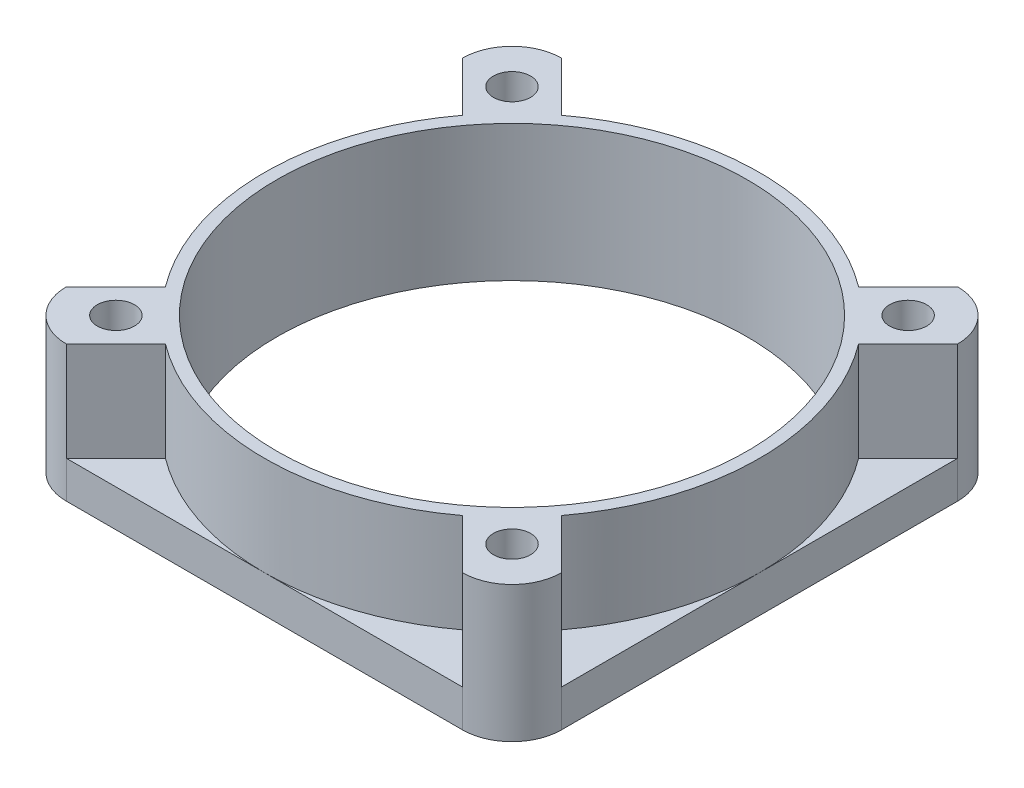
ISO-10303-21;
HEADER;
FILE_DESCRIPTION(('STEP AP214'),'2;1');
FILE_NAME('part.step','',(''),(''),'','','');
FILE_SCHEMA(('AUTOMOTIVE_DESIGN { 1 0 10303 214 1 1 1 1 }'));
ENDSEC;
DATA;
#1=APPLICATION_CONTEXT('core data for automotive mechanical design processes');
#2=APPLICATION_PROTOCOL_DEFINITION('international standard','automotive_design',2000,#1);
#3=PRODUCT_CONTEXT('',#1,'mechanical');
#4=PRODUCT('Part','Part','',(#3));
#5=PRODUCT_RELATED_PRODUCT_CATEGORY('part','',(#4));
#6=PRODUCT_DEFINITION_FORMATION('','',#4);
#7=PRODUCT_DEFINITION_CONTEXT('part definition',#1,'design');
#8=PRODUCT_DEFINITION('design','',#6,#7);
#9=PRODUCT_DEFINITION_SHAPE('','',#8);
#10=(LENGTH_UNIT() NAMED_UNIT(*) SI_UNIT(.MILLI.,.METRE.));
#11=(NAMED_UNIT(*) PLANE_ANGLE_UNIT() SI_UNIT($,.RADIAN.));
#12=(NAMED_UNIT(*) SI_UNIT($,.STERADIAN.) SOLID_ANGLE_UNIT());
#13=UNCERTAINTY_MEASURE_WITH_UNIT(LENGTH_MEASURE(1.E-05),#10,'distance_accuracy_value','');
#14=(GEOMETRIC_REPRESENTATION_CONTEXT(3) GLOBAL_UNCERTAINTY_ASSIGNED_CONTEXT((#13)) GLOBAL_UNIT_ASSIGNED_CONTEXT((#10,
#11,#12)) REPRESENTATION_CONTEXT('',''));
#15=CARTESIAN_POINT('',(0.,0.,0.));
#16=DIRECTION('',(0.,0.,1.));
#17=DIRECTION('',(1.,0.,0.));
#18=AXIS2_PLACEMENT_3D('',#15,#16,#17);
#19=CARTESIAN_POINT('',(0.,11.,0.));
#20=DIRECTION('',(0.,-1.,0.));
#21=DIRECTION('',(0.,0.,-1.));
#22=AXIS2_PLACEMENT_3D('',#19,#20,#21);
#23=PLANE('',#22);
#24=CARTESIAN_POINT('',(4.,11.,-36.));
#25=DIRECTION('',(0.,1.,0.));
#26=DIRECTION('',(0.,0.,1.));
#27=AXIS2_PLACEMENT_3D('',#24,#25,#26);
#28=CIRCLE('',#27,1.5);
#29=CARTESIAN_POINT('',(4.,11.,-34.5));
#30=VERTEX_POINT('',#29);
#31=EDGE_CURVE('E737',#30,#30,#28,.T.);
#32=ORIENTED_EDGE('',*,*,#31,.F.);
#33=EDGE_LOOP('',(#32));
#34=FACE_BOUND('',#33,.T.);
#35=CARTESIAN_POINT('',(4.,11.,-4.));
#36=DIRECTION('',(0.,1.,0.));
#37=DIRECTION('',(0.,0.,1.));
#38=AXIS2_PLACEMENT_3D('',#35,#36,#37);
#39=CIRCLE('',#38,1.5);
#40=CARTESIAN_POINT('',(4.,11.,-2.5));
#41=VERTEX_POINT('',#40);
#42=EDGE_CURVE('E743',#41,#41,#39,.T.);
#43=ORIENTED_EDGE('',*,*,#42,.F.);
#44=EDGE_LOOP('',(#43));
#45=FACE_BOUND('',#44,.T.);
#46=CARTESIAN_POINT('',(36.,11.,-4.));
#47=DIRECTION('',(0.,1.,0.));
#48=DIRECTION('',(0.,0.,1.));
#49=AXIS2_PLACEMENT_3D('',#46,#47,#48);
#50=CIRCLE('',#49,1.5);
#51=CARTESIAN_POINT('',(36.,11.,-2.5));
#52=VERTEX_POINT('',#51);
#53=EDGE_CURVE('E751',#52,#52,#50,.T.);
#54=ORIENTED_EDGE('',*,*,#53,.F.);
#55=EDGE_LOOP('',(#54));
#56=FACE_BOUND('',#55,.T.);
#57=CARTESIAN_POINT('',(36.,11.,-36.));
#58=DIRECTION('',(0.,1.,0.));
#59=DIRECTION('',(0.,0.,1.));
#60=AXIS2_PLACEMENT_3D('',#57,#58,#59);
#61=CIRCLE('',#60,1.5);
#62=CARTESIAN_POINT('',(36.,11.,-34.5));
#63=VERTEX_POINT('',#62);
#64=EDGE_CURVE('E740',#63,#63,#61,.T.);
#65=ORIENTED_EDGE('',*,*,#64,.F.);
#66=EDGE_LOOP('',(#65));
#67=FACE_BOUND('',#66,.T.);
#68=CARTESIAN_POINT('',(20.,11.,-20.));
#69=DIRECTION('',(0.,1.,0.));
#70=DIRECTION('',(0.,0.,1.));
#71=AXIS2_PLACEMENT_3D('',#68,#69,#70);
#72=CIRCLE('',#71,19.);
#73=CARTESIAN_POINT('',(20.,11.,-1.));
#74=VERTEX_POINT('',#73);
#75=EDGE_CURVE('E342',#74,#74,#72,.T.);
#76=ORIENTED_EDGE('',*,*,#75,.F.);
#77=EDGE_LOOP('',(#76));
#78=FACE_BOUND('',#77,.T.);
#79=DIRECTION('',(0.707106781186546,0.,-0.707106781186549));
#80=VECTOR('',#79,1.);
#81=CARTESIAN_POINT('',(2.00000000000001,11.,2.));
#82=LINE('',#81,#80);
#83=CARTESIAN_POINT('',(4.,11.,0.));
#84=VERTEX_POINT('',#83);
#85=CARTESIAN_POINT('',(7.99999999999999,11.,-4.00000000000001));
#86=VERTEX_POINT('',#85);
#87=EDGE_CURVE('E223',#84,#86,#82,.T.);
#88=ORIENTED_EDGE('',*,*,#87,.T.);
#89=CARTESIAN_POINT('',(20.,11.,-20.));
#90=DIRECTION('',(0.,1.,0.));
#91=DIRECTION('',(0.,0.,1.));
#92=AXIS2_PLACEMENT_3D('',#89,#90,#91);
#93=CIRCLE('',#92,20.);
#94=CARTESIAN_POINT('',(32.,11.,-4.));
#95=VERTEX_POINT('',#94);
#96=EDGE_CURVE('E394',#86,#95,#93,.T.);
#97=ORIENTED_EDGE('',*,*,#96,.T.);
#98=DIRECTION('',(-0.707106781186551,0.,-0.707106781186544));
#99=VECTOR('',#98,1.);
#100=CARTESIAN_POINT('',(17.9999999999998,11.,-18.));
#101=LINE('',#100,#99);
#102=CARTESIAN_POINT('',(36.,11.,0.));
#103=VERTEX_POINT('',#102);
#104=EDGE_CURVE('E401',#103,#95,#101,.T.);
#105=ORIENTED_EDGE('',*,*,#104,.F.);
#106=CARTESIAN_POINT('',(36.,11.,-4.));
#107=DIRECTION('',(0.,-1.,0.));
#108=DIRECTION('',(0.,0.,-1.));
#109=AXIS2_PLACEMENT_3D('',#106,#107,#108);
#110=CIRCLE('',#109,4.);
#111=CARTESIAN_POINT('',(40.,11.,-4.));
#112=VERTEX_POINT('',#111);
#113=EDGE_CURVE('E365',#103,#112,#110,.F.);
#114=ORIENTED_EDGE('',*,*,#113,.T.);
#115=DIRECTION('',(-0.707106781186551,0.,-0.707106781186544));
#116=VECTOR('',#115,1.);
#117=CARTESIAN_POINT('',(21.9999999999998,11.,-22.));
#118=LINE('',#117,#116);
#119=CARTESIAN_POINT('',(36.,11.,-7.99999999999997));
#120=VERTEX_POINT('',#119);
#121=EDGE_CURVE('E412',#112,#120,#118,.T.);
#122=ORIENTED_EDGE('',*,*,#121,.T.);
#123=CARTESIAN_POINT('',(20.,11.,-20.));
#124=DIRECTION('',(0.,1.,0.));
#125=DIRECTION('',(0.,0.,1.));
#126=AXIS2_PLACEMENT_3D('',#123,#124,#125);
#127=CIRCLE('',#126,20.);
#128=CARTESIAN_POINT('',(36.,11.,-32.));
#129=VERTEX_POINT('',#128);
#130=EDGE_CURVE('E423',#120,#129,#127,.T.);
#131=ORIENTED_EDGE('',*,*,#130,.T.);
#132=DIRECTION('',(-0.707106781186541,0.,0.707106781186554));
#133=VECTOR('',#132,1.);
#134=CARTESIAN_POINT('',(2.00000000000038,11.,2.00000000000034));
#135=LINE('',#134,#133);
#136=CARTESIAN_POINT('',(40.,11.,-36.));
#137=VERTEX_POINT('',#136);
#138=EDGE_CURVE('E281',#137,#129,#135,.T.);
#139=ORIENTED_EDGE('',*,*,#138,.F.);
#140=CARTESIAN_POINT('',(36.,11.,-36.));
#141=DIRECTION('',(0.,-1.,0.));
#142=DIRECTION('',(0.,0.,-1.));
#143=AXIS2_PLACEMENT_3D('',#140,#141,#142);
#144=CIRCLE('',#143,4.);
#145=CARTESIAN_POINT('',(36.,11.,-40.));
#146=VERTEX_POINT('',#145);
#147=EDGE_CURVE('E79',#137,#146,#144,.F.);
#148=ORIENTED_EDGE('',*,*,#147,.T.);
#149=DIRECTION('',(-0.707106781186542,0.,0.707106781186553));
#150=VECTOR('',#149,1.);
#151=CARTESIAN_POINT('',(-1.99999999999971,11.,-1.99999999999968));
#152=LINE('',#151,#150);
#153=CARTESIAN_POINT('',(32.,11.,-36.));
#154=VERTEX_POINT('',#153);
#155=EDGE_CURVE('E278',#146,#154,#152,.T.);
#156=ORIENTED_EDGE('',*,*,#155,.T.);
#157=CARTESIAN_POINT('',(20.,11.,-20.));
#158=DIRECTION('',(0.,1.,0.));
#159=DIRECTION('',(0.,0.,1.));
#160=AXIS2_PLACEMENT_3D('',#157,#158,#159);
#161=CIRCLE('',#160,20.);
#162=CARTESIAN_POINT('',(8.00000000000002,11.,-36.));
#163=VERTEX_POINT('',#162);
#164=EDGE_CURVE('E306',#154,#163,#161,.T.);
#165=ORIENTED_EDGE('',*,*,#164,.T.);
#166=DIRECTION('',(0.707106781186551,0.,0.707106781186544));
#167=VECTOR('',#166,1.);
#168=CARTESIAN_POINT('',(22.,11.,-22.0000000000002));
#169=LINE('',#168,#167);
#170=CARTESIAN_POINT('',(4.,11.,-40.));
#171=VERTEX_POINT('',#170);
#172=EDGE_CURVE('E314',#171,#163,#169,.T.);
#173=ORIENTED_EDGE('',*,*,#172,.F.);
#174=CARTESIAN_POINT('',(4.,11.,-36.));
#175=DIRECTION('',(0.,-1.,0.));
#176=DIRECTION('',(0.,0.,-1.));
#177=AXIS2_PLACEMENT_3D('',#174,#175,#176);
#178=CIRCLE('',#177,4.);
#179=CARTESIAN_POINT('',(0.,11.,-36.));
#180=VERTEX_POINT('',#179);
#181=EDGE_CURVE('E261',#171,#180,#178,.F.);
#182=ORIENTED_EDGE('',*,*,#181,.T.);
#183=DIRECTION('',(0.707106781186556,0.,0.707106781186539));
#184=VECTOR('',#183,1.);
#185=CARTESIAN_POINT('',(18.,11.,-18.0000000000004));
#186=LINE('',#185,#184);
#187=CARTESIAN_POINT('',(4.00000000000004,11.,-32.0000000000001));
#188=VERTEX_POINT('',#187);
#189=EDGE_CURVE('E331',#180,#188,#186,.T.);
#190=ORIENTED_EDGE('',*,*,#189,.T.);
#191=CARTESIAN_POINT('',(20.,11.,-20.));
#192=DIRECTION('',(0.,1.,0.));
#193=DIRECTION('',(0.,0.,1.));
#194=AXIS2_PLACEMENT_3D('',#191,#192,#193);
#195=CIRCLE('',#194,20.);
#196=CARTESIAN_POINT('',(3.99999999999999,11.,-8.00000000000001));
#197=VERTEX_POINT('',#196);
#198=EDGE_CURVE('E325',#188,#197,#195,.T.);
#199=ORIENTED_EDGE('',*,*,#198,.T.);
#200=DIRECTION('',(0.707106781186546,0.,-0.707106781186549));
#201=VECTOR('',#200,1.);
#202=CARTESIAN_POINT('',(-2.,11.,-1.99999999999999));
#203=LINE('',#202,#201);
#204=CARTESIAN_POINT('',(0.,11.,-4.));
#205=VERTEX_POINT('',#204);
#206=EDGE_CURVE('E238',#205,#197,#203,.T.);
#207=ORIENTED_EDGE('',*,*,#206,.F.);
#208=CARTESIAN_POINT('',(4.,11.,-4.));
#209=DIRECTION('',(0.,-1.,0.));
#210=DIRECTION('',(0.,0.,-1.));
#211=AXIS2_PLACEMENT_3D('',#208,#209,#210);
#212=CIRCLE('',#211,4.);
#213=EDGE_CURVE('E236',#205,#84,#212,.F.);
#214=ORIENTED_EDGE('',*,*,#213,.T.);
#215=EDGE_LOOP('',(#88,#97,#105,#114,#122,#131,#139,#148,#156,#165,#173,#182,#190,#199,#207,#214));
#216=FACE_BOUND('',#215,.T.);
#217=ADVANCED_FACE('F71',(#34,#45,#56,#67,#78,#216),#23,.F.);
#218=CARTESIAN_POINT('',(0.,11.,0.));
#219=DIRECTION('',(0.,0.,-1.));
#220=DIRECTION('',(-1.,0.,0.));
#221=AXIS2_PLACEMENT_3D('',#218,#219,#220);
#222=PLANE('',#221);
#223=DIRECTION('',(1.,0.,0.));
#224=VECTOR('',#223,1.);
#225=CARTESIAN_POINT('',(0.,3.,0.));
#226=LINE('',#225,#224);
#227=CARTESIAN_POINT('',(4.,3.,0.));
#228=VERTEX_POINT('',#227);
#229=CARTESIAN_POINT('',(20.,3.,0.));
#230=VERTEX_POINT('',#229);
#231=EDGE_CURVE('E86',#228,#230,#226,.T.);
#232=ORIENTED_EDGE('',*,*,#231,.F.);
#233=DIRECTION('',(0.,1.,0.));
#234=VECTOR('',#233,1.);
#235=CARTESIAN_POINT('',(4.,11.,0.));
#236=LINE('',#235,#234);
#237=CARTESIAN_POINT('',(4.,0.,0.));
#238=VERTEX_POINT('',#237);
#239=EDGE_CURVE('E248',#228,#238,#236,.F.);
#240=ORIENTED_EDGE('',*,*,#239,.T.);
#241=DIRECTION('',(1.,0.,0.));
#242=VECTOR('',#241,1.);
#243=CARTESIAN_POINT('',(0.,0.,0.));
#244=LINE('',#243,#242);
#245=CARTESIAN_POINT('',(36.,0.,0.));
#246=VERTEX_POINT('',#245);
#247=EDGE_CURVE('E350',#238,#246,#244,.T.);
#248=ORIENTED_EDGE('',*,*,#247,.T.);
#249=DIRECTION('',(0.,1.,0.));
#250=VECTOR('',#249,1.);
#251=CARTESIAN_POINT('',(36.,11.,0.));
#252=LINE('',#251,#250);
#253=CARTESIAN_POINT('',(36.,3.,0.));
#254=VERTEX_POINT('',#253);
#255=EDGE_CURVE('E357',#246,#254,#252,.T.);
#256=ORIENTED_EDGE('',*,*,#255,.T.);
#257=DIRECTION('',(1.,0.,0.));
#258=VECTOR('',#257,1.);
#259=CARTESIAN_POINT('',(0.,3.,0.));
#260=LINE('',#259,#258);
#261=EDGE_CURVE('E400',#230,#254,#260,.T.);
#262=ORIENTED_EDGE('',*,*,#261,.F.);
#263=EDGE_LOOP('',(#232,#240,#248,#256,#262));
#264=FACE_BOUND('',#263,.T.);
#265=ADVANCED_FACE('F482',(#264),#222,.F.);
#266=CARTESIAN_POINT('',(0.,11.,0.));
#267=DIRECTION('',(1.,0.,0.));
#268=DIRECTION('',(0.,0.,-1.));
#269=AXIS2_PLACEMENT_3D('',#266,#267,#268);
#270=PLANE('',#269);
#271=DIRECTION('',(0.,0.,1.));
#272=VECTOR('',#271,1.);
#273=CARTESIAN_POINT('',(0.,3.,0.));
#274=LINE('',#273,#272);
#275=CARTESIAN_POINT('',(0.,3.,-20.));
#276=VERTEX_POINT('',#275);
#277=CARTESIAN_POINT('',(0.,3.,-4.));
#278=VERTEX_POINT('',#277);
#279=EDGE_CURVE('E376',#276,#278,#274,.T.);
#280=ORIENTED_EDGE('',*,*,#279,.F.);
#281=DIRECTION('',(0.,0.,1.));
#282=VECTOR('',#281,1.);
#283=CARTESIAN_POINT('',(0.,3.,0.));
#284=LINE('',#283,#282);
#285=CARTESIAN_POINT('',(0.,3.,-36.));
#286=VERTEX_POINT('',#285);
#287=EDGE_CURVE('E333',#286,#276,#284,.T.);
#288=ORIENTED_EDGE('',*,*,#287,.F.);
#289=DIRECTION('',(0.,-1.,0.));
#290=VECTOR('',#289,1.);
#291=CARTESIAN_POINT('',(0.,11.,-36.));
#292=LINE('',#291,#290);
#293=CARTESIAN_POINT('',(0.,0.,-36.));
#294=VERTEX_POINT('',#293);
#295=EDGE_CURVE('E241',#286,#294,#292,.T.);
#296=ORIENTED_EDGE('',*,*,#295,.T.);
#297=DIRECTION('',(0.,0.,1.));
#298=VECTOR('',#297,1.);
#299=CARTESIAN_POINT('',(0.,0.,0.));
#300=LINE('',#299,#298);
#301=CARTESIAN_POINT('',(0.,0.,-4.));
#302=VERTEX_POINT('',#301);
#303=EDGE_CURVE('E346',#294,#302,#300,.T.);
#304=ORIENTED_EDGE('',*,*,#303,.T.);
#305=DIRECTION('',(0.,1.,0.));
#306=VECTOR('',#305,1.);
#307=CARTESIAN_POINT('',(0.,11.,-4.));
#308=LINE('',#307,#306);
#309=EDGE_CURVE('E252',#302,#278,#308,.T.);
#310=ORIENTED_EDGE('',*,*,#309,.T.);
#311=EDGE_LOOP('',(#280,#288,#296,#304,#310));
#312=FACE_BOUND('',#311,.T.);
#313=ADVANCED_FACE('F374',(#312),#270,.F.);
#314=CARTESIAN_POINT('',(40.,11.,0.));
#315=DIRECTION('',(-1.,0.,0.));
#316=DIRECTION('',(0.,0.,1.));
#317=AXIS2_PLACEMENT_3D('',#314,#315,#316);
#318=PLANE('',#317);
#319=DIRECTION('',(0.,0.,-1.));
#320=VECTOR('',#319,1.);
#321=CARTESIAN_POINT('',(40.,3.,0.));
#322=LINE('',#321,#320);
#323=CARTESIAN_POINT('',(40.,3.,-4.));
#324=VERTEX_POINT('',#323);
#325=CARTESIAN_POINT('',(40.,3.,-20.));
#326=VERTEX_POINT('',#325);
#327=EDGE_CURVE('E94',#324,#326,#322,.T.);
#328=ORIENTED_EDGE('',*,*,#327,.F.);
#329=DIRECTION('',(0.,1.,0.));
#330=VECTOR('',#329,1.);
#331=CARTESIAN_POINT('',(40.,11.,-4.));
#332=LINE('',#331,#330);
#333=CARTESIAN_POINT('',(40.,0.,-4.));
#334=VERTEX_POINT('',#333);
#335=EDGE_CURVE('E360',#324,#334,#332,.F.);
#336=ORIENTED_EDGE('',*,*,#335,.T.);
#337=DIRECTION('',(0.,0.,-1.));
#338=VECTOR('',#337,1.);
#339=CARTESIAN_POINT('',(40.,0.,0.));
#340=LINE('',#339,#338);
#341=CARTESIAN_POINT('',(40.,0.,-36.));
#342=VERTEX_POINT('',#341);
#343=EDGE_CURVE('E352',#334,#342,#340,.T.);
#344=ORIENTED_EDGE('',*,*,#343,.T.);
#345=DIRECTION('',(0.,-1.,0.));
#346=VECTOR('',#345,1.);
#347=CARTESIAN_POINT('',(40.,11.,-36.));
#348=LINE('',#347,#346);
#349=CARTESIAN_POINT('',(40.,3.,-36.));
#350=VERTEX_POINT('',#349);
#351=EDGE_CURVE('E270',#342,#350,#348,.F.);
#352=ORIENTED_EDGE('',*,*,#351,.T.);
#353=DIRECTION('',(0.,0.,-1.));
#354=VECTOR('',#353,1.);
#355=CARTESIAN_POINT('',(40.,3.,0.));
#356=LINE('',#355,#354);
#357=EDGE_CURVE('E426',#326,#350,#356,.T.);
#358=ORIENTED_EDGE('',*,*,#357,.F.);
#359=EDGE_LOOP('',(#328,#336,#344,#352,#358));
#360=FACE_BOUND('',#359,.T.);
#361=ADVANCED_FACE('F502',(#360),#318,.F.);
#362=CARTESIAN_POINT('',(0.,11.,-40.));
#363=DIRECTION('',(0.,0.,1.));
#364=DIRECTION('',(1.,0.,0.));
#365=AXIS2_PLACEMENT_3D('',#362,#363,#364);
#366=PLANE('',#365);
#367=DIRECTION('',(-1.,0.,0.));
#368=VECTOR('',#367,1.);
#369=CARTESIAN_POINT('',(0.,3.,-40.));
#370=LINE('',#369,#368);
#371=CARTESIAN_POINT('',(36.,3.,-40.));
#372=VERTEX_POINT('',#371);
#373=CARTESIAN_POINT('',(20.,3.,-40.));
#374=VERTEX_POINT('',#373);
#375=EDGE_CURVE('E296',#372,#374,#370,.T.);
#376=ORIENTED_EDGE('',*,*,#375,.F.);
#377=DIRECTION('',(0.,-1.,0.));
#378=VECTOR('',#377,1.);
#379=CARTESIAN_POINT('',(36.,11.,-40.));
#380=LINE('',#379,#378);
#381=CARTESIAN_POINT('',(36.,0.,-40.));
#382=VERTEX_POINT('',#381);
#383=EDGE_CURVE('E267',#372,#382,#380,.T.);
#384=ORIENTED_EDGE('',*,*,#383,.T.);
#385=DIRECTION('',(-1.,0.,0.));
#386=VECTOR('',#385,1.);
#387=CARTESIAN_POINT('',(0.,0.,-40.));
#388=LINE('',#387,#386);
#389=CARTESIAN_POINT('',(4.,0.,-40.));
#390=VERTEX_POINT('',#389);
#391=EDGE_CURVE('E355',#382,#390,#388,.T.);
#392=ORIENTED_EDGE('',*,*,#391,.T.);
#393=DIRECTION('',(0.,-1.,0.));
#394=VECTOR('',#393,1.);
#395=CARTESIAN_POINT('',(4.,11.,-40.));
#396=LINE('',#395,#394);
#397=CARTESIAN_POINT('',(4.,3.,-40.));
#398=VERTEX_POINT('',#397);
#399=EDGE_CURVE('E258',#390,#398,#396,.F.);
#400=ORIENTED_EDGE('',*,*,#399,.T.);
#401=DIRECTION('',(-1.,0.,0.));
#402=VECTOR('',#401,1.);
#403=CARTESIAN_POINT('',(0.,3.,-40.));
#404=LINE('',#403,#402);
#405=EDGE_CURVE('E303',#374,#398,#404,.T.);
#406=ORIENTED_EDGE('',*,*,#405,.F.);
#407=EDGE_LOOP('',(#376,#384,#392,#400,#406));
#408=FACE_BOUND('',#407,.T.);
#409=ADVANCED_FACE('F302',(#408),#366,.F.);
#410=CARTESIAN_POINT('',(36.,11.,-36.));
#411=DIRECTION('',(0.,-1.,0.));
#412=DIRECTION('',(0.,0.,-1.));
#413=AXIS2_PLACEMENT_3D('',#410,#411,#412);
#414=CYLINDRICAL_SURFACE('',#413,4.);
#415=EDGE_CURVE('E268',#146,#372,#380,.T.);
#416=ORIENTED_EDGE('',*,*,#415,.F.);
#417=ORIENTED_EDGE('',*,*,#147,.F.);
#418=DIRECTION('',(0.,1.,0.));
#419=VECTOR('',#418,1.);
#420=CARTESIAN_POINT('',(40.,3.,-36.));
#421=LINE('',#420,#419);
#422=EDGE_CURVE('E431',#350,#137,#421,.T.);
#423=ORIENTED_EDGE('',*,*,#422,.F.);
#424=ORIENTED_EDGE('',*,*,#351,.F.);
#425=CARTESIAN_POINT('',(36.,0.,-36.));
#426=DIRECTION('',(0.,-1.,0.));
#427=DIRECTION('',(0.,0.,-1.));
#428=AXIS2_PLACEMENT_3D('',#425,#426,#427);
#429=CIRCLE('',#428,4.);
#430=EDGE_CURVE('E12',#382,#342,#429,.T.);
#431=ORIENTED_EDGE('',*,*,#430,.F.);
#432=ORIENTED_EDGE('',*,*,#383,.F.);
#433=EDGE_LOOP('',(#416,#417,#423,#424,#431,#432));
#434=FACE_BOUND('',#433,.T.);
#435=ADVANCED_FACE('F73',(#434),#414,.T.);
#436=CARTESIAN_POINT('',(4.,11.,-36.));
#437=DIRECTION('',(0.,-1.,0.));
#438=DIRECTION('',(0.,0.,-1.));
#439=AXIS2_PLACEMENT_3D('',#436,#437,#438);
#440=CYLINDRICAL_SURFACE('',#439,4.);
#441=EDGE_CURVE('E256',#180,#286,#292,.T.);
#442=ORIENTED_EDGE('',*,*,#441,.F.);
#443=ORIENTED_EDGE('',*,*,#181,.F.);
#444=DIRECTION('',(0.,1.,0.));
#445=VECTOR('',#444,1.);
#446=CARTESIAN_POINT('',(4.,3.,-40.));
#447=LINE('',#446,#445);
#448=EDGE_CURVE('E319',#398,#171,#447,.T.);
#449=ORIENTED_EDGE('',*,*,#448,.F.);
#450=ORIENTED_EDGE('',*,*,#399,.F.);
#451=CARTESIAN_POINT('',(4.,0.,-36.));
#452=DIRECTION('',(0.,-1.,0.));
#453=DIRECTION('',(0.,0.,-1.));
#454=AXIS2_PLACEMENT_3D('',#451,#452,#453);
#455=CIRCLE('',#454,4.);
#456=EDGE_CURVE('E264',#294,#390,#455,.T.);
#457=ORIENTED_EDGE('',*,*,#456,.F.);
#458=ORIENTED_EDGE('',*,*,#295,.F.);
#459=EDGE_LOOP('',(#442,#443,#449,#450,#457,#458));
#460=FACE_BOUND('',#459,.T.);
#461=ADVANCED_FACE('F450',(#460),#440,.T.);
#462=CARTESIAN_POINT('',(4.,11.,-4.));
#463=DIRECTION('',(0.,1.,0.));
#464=DIRECTION('',(0.,0.,1.));
#465=AXIS2_PLACEMENT_3D('',#462,#463,#464);
#466=CYLINDRICAL_SURFACE('',#465,4.);
#467=ORIENTED_EDGE('',*,*,#309,.F.);
#468=CARTESIAN_POINT('',(4.,0.,-4.));
#469=DIRECTION('',(0.,-1.,0.));
#470=DIRECTION('',(0.,0.,-1.));
#471=AXIS2_PLACEMENT_3D('',#468,#469,#470);
#472=CIRCLE('',#471,4.);
#473=EDGE_CURVE('E242',#238,#302,#472,.T.);
#474=ORIENTED_EDGE('',*,*,#473,.F.);
#475=ORIENTED_EDGE('',*,*,#239,.F.);
#476=EDGE_CURVE('E227',#84,#228,#236,.F.);
#477=ORIENTED_EDGE('',*,*,#476,.F.);
#478=ORIENTED_EDGE('',*,*,#213,.F.);
#479=DIRECTION('',(0.,1.,0.));
#480=VECTOR('',#479,1.);
#481=CARTESIAN_POINT('',(0.,3.,-4.));
#482=LINE('',#481,#480);
#483=EDGE_CURVE('E379',#278,#205,#482,.T.);
#484=ORIENTED_EDGE('',*,*,#483,.F.);
#485=EDGE_LOOP('',(#467,#474,#475,#477,#478,#484));
#486=FACE_BOUND('',#485,.T.);
#487=ADVANCED_FACE('F246',(#486),#466,.T.);
#488=CARTESIAN_POINT('',(36.,11.,-4.));
#489=DIRECTION('',(0.,1.,0.));
#490=DIRECTION('',(0.,0.,1.));
#491=AXIS2_PLACEMENT_3D('',#488,#489,#490);
#492=CYLINDRICAL_SURFACE('',#491,4.);
#493=ORIENTED_EDGE('',*,*,#255,.F.);
#494=CARTESIAN_POINT('',(36.,0.,-4.));
#495=DIRECTION('',(0.,-1.,0.));
#496=DIRECTION('',(0.,0.,-1.));
#497=AXIS2_PLACEMENT_3D('',#494,#495,#496);
#498=CIRCLE('',#497,4.);
#499=EDGE_CURVE('E363',#334,#246,#498,.T.);
#500=ORIENTED_EDGE('',*,*,#499,.F.);
#501=ORIENTED_EDGE('',*,*,#335,.F.);
#502=EDGE_CURVE('E361',#112,#324,#332,.F.);
#503=ORIENTED_EDGE('',*,*,#502,.F.);
#504=ORIENTED_EDGE('',*,*,#113,.F.);
#505=DIRECTION('',(0.,1.,0.));
#506=VECTOR('',#505,1.);
#507=CARTESIAN_POINT('',(36.,3.,0.));
#508=LINE('',#507,#506);
#509=EDGE_CURVE('E406',#254,#103,#508,.T.);
#510=ORIENTED_EDGE('',*,*,#509,.F.);
#511=EDGE_LOOP('',(#493,#500,#501,#503,#504,#510));
#512=FACE_BOUND('',#511,.T.);
#513=ADVANCED_FACE('F498',(#512),#492,.T.);
#514=CARTESIAN_POINT('',(0.,0.,0.));
#515=DIRECTION('',(0.,-1.,0.));
#516=DIRECTION('',(0.,0.,-1.));
#517=AXIS2_PLACEMENT_3D('',#514,#515,#516);
#518=PLANE('',#517);
#519=CARTESIAN_POINT('',(4.,0.,-36.));
#520=DIRECTION('',(0.,1.,0.));
#521=DIRECTION('',(0.,0.,1.));
#522=AXIS2_PLACEMENT_3D('',#519,#520,#521);
#523=CIRCLE('',#522,1.5);
#524=CARTESIAN_POINT('',(4.,0.,-34.5));
#525=VERTEX_POINT('',#524);
#526=EDGE_CURVE('E735',#525,#525,#523,.T.);
#527=ORIENTED_EDGE('',*,*,#526,.T.);
#528=EDGE_LOOP('',(#527));
#529=FACE_BOUND('',#528,.T.);
#530=CARTESIAN_POINT('',(4.,0.,-4.));
#531=DIRECTION('',(0.,1.,0.));
#532=DIRECTION('',(0.,0.,1.));
#533=AXIS2_PLACEMENT_3D('',#530,#531,#532);
#534=CIRCLE('',#533,1.5);
#535=CARTESIAN_POINT('',(4.,0.,-2.5));
#536=VERTEX_POINT('',#535);
#537=EDGE_CURVE('E738',#536,#536,#534,.T.);
#538=ORIENTED_EDGE('',*,*,#537,.T.);
#539=EDGE_LOOP('',(#538));
#540=FACE_BOUND('',#539,.T.);
#541=CARTESIAN_POINT('',(36.,0.,-4.));
#542=DIRECTION('',(0.,1.,0.));
#543=DIRECTION('',(0.,0.,1.));
#544=AXIS2_PLACEMENT_3D('',#541,#542,#543);
#545=CIRCLE('',#544,1.5);
#546=CARTESIAN_POINT('',(36.,0.,-2.5));
#547=VERTEX_POINT('',#546);
#548=EDGE_CURVE('E748',#547,#547,#545,.T.);
#549=ORIENTED_EDGE('',*,*,#548,.T.);
#550=EDGE_LOOP('',(#549));
#551=FACE_BOUND('',#550,.T.);
#552=CARTESIAN_POINT('',(36.,0.,-36.));
#553=DIRECTION('',(0.,1.,0.));
#554=DIRECTION('',(0.,0.,1.));
#555=AXIS2_PLACEMENT_3D('',#552,#553,#554);
#556=CIRCLE('',#555,1.5);
#557=CARTESIAN_POINT('',(36.,0.,-34.5));
#558=VERTEX_POINT('',#557);
#559=EDGE_CURVE('E754',#558,#558,#556,.T.);
#560=ORIENTED_EDGE('',*,*,#559,.T.);
#561=EDGE_LOOP('',(#560));
#562=FACE_BOUND('',#561,.T.);
#563=CARTESIAN_POINT('',(20.,0.,-20.));
#564=DIRECTION('',(0.,1.,0.));
#565=DIRECTION('',(0.,0.,1.));
#566=AXIS2_PLACEMENT_3D('',#563,#564,#565);
#567=CIRCLE('',#566,19.);
#568=CARTESIAN_POINT('',(20.,0.,-1.));
#569=VERTEX_POINT('',#568);
#570=EDGE_CURVE('E343',#569,#569,#567,.T.);
#571=ORIENTED_EDGE('',*,*,#570,.T.);
#572=EDGE_LOOP('',(#571));
#573=FACE_BOUND('',#572,.T.);
#574=ORIENTED_EDGE('',*,*,#391,.F.);
#575=ORIENTED_EDGE('',*,*,#430,.T.);
#576=ORIENTED_EDGE('',*,*,#343,.F.);
#577=ORIENTED_EDGE('',*,*,#499,.T.);
#578=ORIENTED_EDGE('',*,*,#247,.F.);
#579=ORIENTED_EDGE('',*,*,#473,.T.);
#580=ORIENTED_EDGE('',*,*,#303,.F.);
#581=ORIENTED_EDGE('',*,*,#456,.T.);
#582=EDGE_LOOP('',(#574,#575,#576,#577,#578,#579,#580,#581));
#583=FACE_BOUND('',#582,.T.);
#584=ADVANCED_FACE('F454',(#529,#540,#551,#562,#573,#583),#518,.T.);
#585=CARTESIAN_POINT('',(20.,0.,-20.));
#586=DIRECTION('',(0.,1.,0.));
#587=DIRECTION('',(0.,0.,1.));
#588=AXIS2_PLACEMENT_3D('',#585,#586,#587);
#589=CYLINDRICAL_SURFACE('',#588,19.);
#590=ORIENTED_EDGE('',*,*,#570,.F.);
#591=EDGE_LOOP('',(#590));
#592=FACE_BOUND('',#591,.T.);
#593=ORIENTED_EDGE('',*,*,#75,.T.);
#594=EDGE_LOOP('',(#593));
#595=FACE_BOUND('',#594,.T.);
#596=ADVANCED_FACE('F494',(#592,#595),#589,.F.);
#597=CARTESIAN_POINT('',(20.,3.,-20.));
#598=DIRECTION('',(0.,1.,0.));
#599=DIRECTION('',(0.,0.,1.));
#600=AXIS2_PLACEMENT_3D('',#597,#598,#599);
#601=CYLINDRICAL_SURFACE('',#600,20.);
#602=ORIENTED_EDGE('',*,*,#198,.F.);
#603=DIRECTION('',(0.,1.,0.));
#604=VECTOR('',#603,1.);
#605=CARTESIAN_POINT('',(4.00000000000005,3.,-32.0000000000001));
#606=LINE('',#605,#604);
#607=CARTESIAN_POINT('',(4.00000000000005,3.,-32.0000000000001));
#608=VERTEX_POINT('',#607);
#609=EDGE_CURVE('E336',#608,#188,#606,.T.);
#610=ORIENTED_EDGE('',*,*,#609,.F.);
#611=CARTESIAN_POINT('',(20.,3.,-20.));
#612=DIRECTION('',(0.,1.,0.));
#613=DIRECTION('',(0.,0.,1.));
#614=AXIS2_PLACEMENT_3D('',#611,#612,#613);
#615=CIRCLE('',#614,20.);
#616=EDGE_CURVE('E327',#608,#276,#615,.T.);
#617=ORIENTED_EDGE('',*,*,#616,.T.);
#618=CARTESIAN_POINT('',(20.,3.,-20.));
#619=DIRECTION('',(0.,1.,0.));
#620=DIRECTION('',(0.,0.,1.));
#621=AXIS2_PLACEMENT_3D('',#618,#619,#620);
#622=CIRCLE('',#621,20.);
#623=CARTESIAN_POINT('',(3.99999999999999,3.,-8.00000000000001));
#624=VERTEX_POINT('',#623);
#625=EDGE_CURVE('E382',#276,#624,#622,.T.);
#626=ORIENTED_EDGE('',*,*,#625,.T.);
#627=DIRECTION('',(0.,1.,0.));
#628=VECTOR('',#627,1.);
#629=CARTESIAN_POINT('',(3.99999999999999,3.,-8.00000000000001));
#630=LINE('',#629,#628);
#631=EDGE_CURVE('E385',#624,#197,#630,.T.);
#632=ORIENTED_EDGE('',*,*,#631,.T.);
#633=EDGE_LOOP('',(#602,#610,#617,#626,#632));
#634=FACE_BOUND('',#633,.T.);
#635=ADVANCED_FACE('F464',(#634),#601,.T.);
#636=CARTESIAN_POINT('',(18.,3.,-18.0000000000004));
#637=DIRECTION('',(-0.707106781186539,0.,0.707106781186556));
#638=DIRECTION('',(0.707106781186556,0.,0.707106781186539));
#639=AXIS2_PLACEMENT_3D('',#636,#637,#638);
#640=PLANE('',#639);
#641=ORIENTED_EDGE('',*,*,#189,.F.);
#642=ORIENTED_EDGE('',*,*,#441,.T.);
#643=DIRECTION('',(0.707106781186556,0.,0.707106781186539));
#644=VECTOR('',#643,1.);
#645=CARTESIAN_POINT('',(18.,3.,-18.0000000000004));
#646=LINE('',#645,#644);
#647=EDGE_CURVE('E330',#286,#608,#646,.T.);
#648=ORIENTED_EDGE('',*,*,#647,.T.);
#649=ORIENTED_EDGE('',*,*,#609,.T.);
#650=EDGE_LOOP('',(#641,#642,#648,#649));
#651=FACE_BOUND('',#650,.T.);
#652=ADVANCED_FACE('F462',(#651),#640,.T.);
#653=CARTESIAN_POINT('',(0.,3.,0.));
#654=DIRECTION('',(0.,1.,0.));
#655=DIRECTION('',(0.,0.,1.));
#656=AXIS2_PLACEMENT_3D('',#653,#654,#655);
#657=PLANE('',#656);
#658=ORIENTED_EDGE('',*,*,#616,.F.);
#659=ORIENTED_EDGE('',*,*,#647,.F.);
#660=ORIENTED_EDGE('',*,*,#287,.T.);
#661=EDGE_LOOP('',(#658,#659,#660));
#662=FACE_BOUND('',#661,.T.);
#663=ADVANCED_FACE('F459',(#662),#657,.T.);
#664=CARTESIAN_POINT('',(20.,3.,-20.));
#665=DIRECTION('',(0.,1.,0.));
#666=DIRECTION('',(0.,0.,1.));
#667=AXIS2_PLACEMENT_3D('',#664,#665,#666);
#668=CYLINDRICAL_SURFACE('',#667,20.);
#669=ORIENTED_EDGE('',*,*,#164,.F.);
#670=DIRECTION('',(0.,1.,0.));
#671=VECTOR('',#670,1.);
#672=CARTESIAN_POINT('',(32.,3.,-36.));
#673=LINE('',#672,#671);
#674=CARTESIAN_POINT('',(32.,3.,-36.));
#675=VERTEX_POINT('',#674);
#676=EDGE_CURVE('E304',#675,#154,#673,.T.);
#677=ORIENTED_EDGE('',*,*,#676,.F.);
#678=CARTESIAN_POINT('',(20.,3.,-20.));
#679=DIRECTION('',(0.,1.,0.));
#680=DIRECTION('',(0.,0.,1.));
#681=AXIS2_PLACEMENT_3D('',#678,#679,#680);
#682=CIRCLE('',#681,20.);
#683=EDGE_CURVE('E298',#675,#374,#682,.T.);
#684=ORIENTED_EDGE('',*,*,#683,.T.);
#685=CARTESIAN_POINT('',(20.,3.,-20.));
#686=DIRECTION('',(0.,1.,0.));
#687=DIRECTION('',(0.,0.,1.));
#688=AXIS2_PLACEMENT_3D('',#685,#686,#687);
#689=CIRCLE('',#688,20.);
#690=CARTESIAN_POINT('',(8.00000000000002,3.,-36.));
#691=VERTEX_POINT('',#690);
#692=EDGE_CURVE('E312',#374,#691,#689,.T.);
#693=ORIENTED_EDGE('',*,*,#692,.T.);
#694=DIRECTION('',(0.,1.,0.));
#695=VECTOR('',#694,1.);
#696=CARTESIAN_POINT('',(8.00000000000002,3.,-36.));
#697=LINE('',#696,#695);
#698=EDGE_CURVE('E323',#691,#163,#697,.T.);
#699=ORIENTED_EDGE('',*,*,#698,.T.);
#700=EDGE_LOOP('',(#669,#677,#684,#693,#699));
#701=FACE_BOUND('',#700,.T.);
#702=ADVANCED_FACE('F437',(#701),#668,.T.);
#703=CARTESIAN_POINT('',(22.,3.,-22.0000000000002));
#704=DIRECTION('',(-0.707106781186544,0.,0.707106781186551));
#705=DIRECTION('',(0.707106781186551,0.,0.707106781186544));
#706=AXIS2_PLACEMENT_3D('',#703,#704,#705);
#707=PLANE('',#706);
#708=ORIENTED_EDGE('',*,*,#172,.T.);
#709=ORIENTED_EDGE('',*,*,#698,.F.);
#710=DIRECTION('',(0.707106781186551,0.,0.707106781186544));
#711=VECTOR('',#710,1.);
#712=CARTESIAN_POINT('',(22.,3.,-22.0000000000002));
#713=LINE('',#712,#711);
#714=EDGE_CURVE('E316',#398,#691,#713,.T.);
#715=ORIENTED_EDGE('',*,*,#714,.F.);
#716=ORIENTED_EDGE('',*,*,#448,.T.);
#717=EDGE_LOOP('',(#708,#709,#715,#716));
#718=FACE_BOUND('',#717,.T.);
#719=ADVANCED_FACE('F444',(#718),#707,.F.);
#720=CARTESIAN_POINT('',(0.,3.,0.));
#721=DIRECTION('',(0.,1.,0.));
#722=DIRECTION('',(0.,0.,1.));
#723=AXIS2_PLACEMENT_3D('',#720,#721,#722);
#724=PLANE('',#723);
#725=ORIENTED_EDGE('',*,*,#692,.F.);
#726=ORIENTED_EDGE('',*,*,#405,.T.);
#727=ORIENTED_EDGE('',*,*,#714,.T.);
#728=EDGE_LOOP('',(#725,#726,#727));
#729=FACE_BOUND('',#728,.T.);
#730=ADVANCED_FACE('F440',(#729),#724,.T.);
#731=CARTESIAN_POINT('',(-1.99999999999971,3.,-1.99999999999968));
#732=DIRECTION('',(-0.707106781186553,0.,-0.707106781186542));
#733=DIRECTION('',(-0.707106781186542,0.,0.707106781186553));
#734=AXIS2_PLACEMENT_3D('',#731,#732,#733);
#735=PLANE('',#734);
#736=ORIENTED_EDGE('',*,*,#155,.F.);
#737=ORIENTED_EDGE('',*,*,#415,.T.);
#738=DIRECTION('',(-0.707106781186542,0.,0.707106781186553));
#739=VECTOR('',#738,1.);
#740=CARTESIAN_POINT('',(-1.99999999999971,3.,-1.99999999999968));
#741=LINE('',#740,#739);
#742=EDGE_CURVE('E290',#372,#675,#741,.T.);
#743=ORIENTED_EDGE('',*,*,#742,.T.);
#744=ORIENTED_EDGE('',*,*,#676,.T.);
#745=EDGE_LOOP('',(#736,#737,#743,#744));
#746=FACE_BOUND('',#745,.T.);
#747=ADVANCED_FACE('F288',(#746),#735,.T.);
#748=CARTESIAN_POINT('',(0.,3.,0.));
#749=DIRECTION('',(0.,1.,0.));
#750=DIRECTION('',(0.,0.,1.));
#751=AXIS2_PLACEMENT_3D('',#748,#749,#750);
#752=PLANE('',#751);
#753=ORIENTED_EDGE('',*,*,#683,.F.);
#754=ORIENTED_EDGE('',*,*,#742,.F.);
#755=ORIENTED_EDGE('',*,*,#375,.T.);
#756=EDGE_LOOP('',(#753,#754,#755));
#757=FACE_BOUND('',#756,.T.);
#758=ADVANCED_FACE('F295',(#757),#752,.T.);
#759=CARTESIAN_POINT('',(20.,3.,-20.));
#760=DIRECTION('',(0.,1.,0.));
#761=DIRECTION('',(0.,0.,1.));
#762=AXIS2_PLACEMENT_3D('',#759,#760,#761);
#763=CYLINDRICAL_SURFACE('',#762,20.);
#764=ORIENTED_EDGE('',*,*,#130,.F.);
#765=DIRECTION('',(0.,1.,0.));
#766=VECTOR('',#765,1.);
#767=CARTESIAN_POINT('',(36.,3.,-7.99999999999997));
#768=LINE('',#767,#766);
#769=CARTESIAN_POINT('',(36.,3.,-7.99999999999997));
#770=VERTEX_POINT('',#769);
#771=EDGE_CURVE('E419',#770,#120,#768,.T.);
#772=ORIENTED_EDGE('',*,*,#771,.F.);
#773=CARTESIAN_POINT('',(20.,3.,-20.));
#774=DIRECTION('',(0.,1.,0.));
#775=DIRECTION('',(0.,0.,1.));
#776=AXIS2_PLACEMENT_3D('',#773,#774,#775);
#777=CIRCLE('',#776,20.);
#778=EDGE_CURVE('E414',#770,#326,#777,.T.);
#779=ORIENTED_EDGE('',*,*,#778,.T.);
#780=CARTESIAN_POINT('',(20.,3.,-20.));
#781=DIRECTION('',(0.,1.,0.));
#782=DIRECTION('',(0.,0.,1.));
#783=AXIS2_PLACEMENT_3D('',#780,#781,#782);
#784=CIRCLE('',#783,20.);
#785=CARTESIAN_POINT('',(36.,3.,-32.));
#786=VERTEX_POINT('',#785);
#787=EDGE_CURVE('E424',#326,#786,#784,.T.);
#788=ORIENTED_EDGE('',*,*,#787,.T.);
#789=DIRECTION('',(0.,1.,0.));
#790=VECTOR('',#789,1.);
#791=CARTESIAN_POINT('',(36.,3.,-32.));
#792=LINE('',#791,#790);
#793=EDGE_CURVE('E310',#786,#129,#792,.T.);
#794=ORIENTED_EDGE('',*,*,#793,.T.);
#795=EDGE_LOOP('',(#764,#772,#779,#788,#794));
#796=FACE_BOUND('',#795,.T.);
#797=ADVANCED_FACE('F595',(#796),#763,.T.);
#798=CARTESIAN_POINT('',(2.00000000000038,3.,2.00000000000034));
#799=DIRECTION('',(-0.707106781186554,0.,-0.707106781186541));
#800=DIRECTION('',(-0.707106781186541,0.,0.707106781186554));
#801=AXIS2_PLACEMENT_3D('',#798,#799,#800);
#802=PLANE('',#801);
#803=ORIENTED_EDGE('',*,*,#138,.T.);
#804=ORIENTED_EDGE('',*,*,#793,.F.);
#805=DIRECTION('',(-0.707106781186541,0.,0.707106781186554));
#806=VECTOR('',#805,1.);
#807=CARTESIAN_POINT('',(2.00000000000038,3.,2.00000000000034));
#808=LINE('',#807,#806);
#809=EDGE_CURVE('E428',#350,#786,#808,.T.);
#810=ORIENTED_EDGE('',*,*,#809,.F.);
#811=ORIENTED_EDGE('',*,*,#422,.T.);
#812=EDGE_LOOP('',(#803,#804,#810,#811));
#813=FACE_BOUND('',#812,.T.);
#814=ADVANCED_FACE('F602',(#813),#802,.F.);
#815=CARTESIAN_POINT('',(0.,3.,0.));
#816=DIRECTION('',(0.,1.,0.));
#817=DIRECTION('',(0.,0.,1.));
#818=AXIS2_PLACEMENT_3D('',#815,#816,#817);
#819=PLANE('',#818);
#820=ORIENTED_EDGE('',*,*,#787,.F.);
#821=ORIENTED_EDGE('',*,*,#357,.T.);
#822=ORIENTED_EDGE('',*,*,#809,.T.);
#823=EDGE_LOOP('',(#820,#821,#822));
#824=FACE_BOUND('',#823,.T.);
#825=ADVANCED_FACE('F610',(#824),#819,.T.);
#826=CARTESIAN_POINT('',(21.9999999999998,3.,-22.));
#827=DIRECTION('',(0.707106781186544,0.,-0.707106781186551));
#828=DIRECTION('',(-0.707106781186551,0.,-0.707106781186544));
#829=AXIS2_PLACEMENT_3D('',#826,#827,#828);
#830=PLANE('',#829);
#831=ORIENTED_EDGE('',*,*,#121,.F.);
#832=ORIENTED_EDGE('',*,*,#502,.T.);
#833=DIRECTION('',(-0.707106781186551,0.,-0.707106781186544));
#834=VECTOR('',#833,1.);
#835=CARTESIAN_POINT('',(21.9999999999998,3.,-22.));
#836=LINE('',#835,#834);
#837=EDGE_CURVE('E416',#324,#770,#836,.T.);
#838=ORIENTED_EDGE('',*,*,#837,.T.);
#839=ORIENTED_EDGE('',*,*,#771,.T.);
#840=EDGE_LOOP('',(#831,#832,#838,#839));
#841=FACE_BOUND('',#840,.T.);
#842=ADVANCED_FACE('F618',(#841),#830,.T.);
#843=CARTESIAN_POINT('',(0.,3.,0.));
#844=DIRECTION('',(0.,1.,0.));
#845=DIRECTION('',(0.,0.,1.));
#846=AXIS2_PLACEMENT_3D('',#843,#844,#845);
#847=PLANE('',#846);
#848=ORIENTED_EDGE('',*,*,#778,.F.);
#849=ORIENTED_EDGE('',*,*,#837,.F.);
#850=ORIENTED_EDGE('',*,*,#327,.T.);
#851=EDGE_LOOP('',(#848,#849,#850));
#852=FACE_BOUND('',#851,.T.);
#853=ADVANCED_FACE('F626',(#852),#847,.T.);
#854=CARTESIAN_POINT('',(20.,3.,-20.));
#855=DIRECTION('',(0.,1.,0.));
#856=DIRECTION('',(0.,0.,1.));
#857=AXIS2_PLACEMENT_3D('',#854,#855,#856);
#858=CYLINDRICAL_SURFACE('',#857,20.);
#859=ORIENTED_EDGE('',*,*,#96,.F.);
#860=DIRECTION('',(0.,1.,0.));
#861=VECTOR('',#860,1.);
#862=CARTESIAN_POINT('',(7.99999999999999,3.,-4.00000000000001));
#863=LINE('',#862,#861);
#864=CARTESIAN_POINT('',(7.99999999999999,3.,-4.00000000000001));
#865=VERTEX_POINT('',#864);
#866=EDGE_CURVE('E229',#865,#86,#863,.T.);
#867=ORIENTED_EDGE('',*,*,#866,.F.);
#868=CARTESIAN_POINT('',(20.,3.,-20.));
#869=DIRECTION('',(0.,1.,0.));
#870=DIRECTION('',(0.,0.,1.));
#871=AXIS2_PLACEMENT_3D('',#868,#869,#870);
#872=CIRCLE('',#871,20.);
#873=EDGE_CURVE('E232',#865,#230,#872,.T.);
#874=ORIENTED_EDGE('',*,*,#873,.T.);
#875=CARTESIAN_POINT('',(20.,3.,-20.));
#876=DIRECTION('',(0.,1.,0.));
#877=DIRECTION('',(0.,0.,1.));
#878=AXIS2_PLACEMENT_3D('',#875,#876,#877);
#879=CIRCLE('',#878,20.);
#880=CARTESIAN_POINT('',(32.,3.,-4.));
#881=VERTEX_POINT('',#880);
#882=EDGE_CURVE('E398',#230,#881,#879,.T.);
#883=ORIENTED_EDGE('',*,*,#882,.T.);
#884=DIRECTION('',(0.,1.,0.));
#885=VECTOR('',#884,1.);
#886=CARTESIAN_POINT('',(32.,3.,-4.));
#887=LINE('',#886,#885);
#888=EDGE_CURVE('E410',#881,#95,#887,.T.);
#889=ORIENTED_EDGE('',*,*,#888,.T.);
#890=EDGE_LOOP('',(#859,#867,#874,#883,#889));
#891=FACE_BOUND('',#890,.T.);
#892=ADVANCED_FACE('F634',(#891),#858,.T.);
#893=CARTESIAN_POINT('',(17.9999999999998,3.,-18.));
#894=DIRECTION('',(0.707106781186544,0.,-0.707106781186551));
#895=DIRECTION('',(-0.707106781186551,0.,-0.707106781186544));
#896=AXIS2_PLACEMENT_3D('',#893,#894,#895);
#897=PLANE('',#896);
#898=ORIENTED_EDGE('',*,*,#104,.T.);
#899=ORIENTED_EDGE('',*,*,#888,.F.);
#900=DIRECTION('',(-0.707106781186551,0.,-0.707106781186544));
#901=VECTOR('',#900,1.);
#902=CARTESIAN_POINT('',(17.9999999999998,3.,-18.));
#903=LINE('',#902,#901);
#904=EDGE_CURVE('E403',#254,#881,#903,.T.);
#905=ORIENTED_EDGE('',*,*,#904,.F.);
#906=ORIENTED_EDGE('',*,*,#509,.T.);
#907=EDGE_LOOP('',(#898,#899,#905,#906));
#908=FACE_BOUND('',#907,.T.);
#909=ADVANCED_FACE('F477',(#908),#897,.F.);
#910=CARTESIAN_POINT('',(0.,3.,0.));
#911=DIRECTION('',(0.,1.,0.));
#912=DIRECTION('',(0.,0.,1.));
#913=AXIS2_PLACEMENT_3D('',#910,#911,#912);
#914=PLANE('',#913);
#915=ORIENTED_EDGE('',*,*,#882,.F.);
#916=ORIENTED_EDGE('',*,*,#261,.T.);
#917=ORIENTED_EDGE('',*,*,#904,.T.);
#918=EDGE_LOOP('',(#915,#916,#917));
#919=FACE_BOUND('',#918,.T.);
#920=ADVANCED_FACE('F469',(#919),#914,.T.);
#921=CARTESIAN_POINT('',(-2.,3.,-1.99999999999999));
#922=DIRECTION('',(0.707106781186549,0.,0.707106781186546));
#923=DIRECTION('',(0.707106781186546,0.,-0.707106781186549));
#924=AXIS2_PLACEMENT_3D('',#921,#922,#923);
#925=PLANE('',#924);
#926=ORIENTED_EDGE('',*,*,#206,.T.);
#927=ORIENTED_EDGE('',*,*,#631,.F.);
#928=DIRECTION('',(0.707106781186546,0.,-0.707106781186549));
#929=VECTOR('',#928,1.);
#930=CARTESIAN_POINT('',(-2.,3.,-1.99999999999999));
#931=LINE('',#930,#929);
#932=EDGE_CURVE('E392',#278,#624,#931,.T.);
#933=ORIENTED_EDGE('',*,*,#932,.F.);
#934=ORIENTED_EDGE('',*,*,#483,.T.);
#935=EDGE_LOOP('',(#926,#927,#933,#934));
#936=FACE_BOUND('',#935,.T.);
#937=ADVANCED_FACE('F466',(#936),#925,.F.);
#938=CARTESIAN_POINT('',(0.,3.,0.));
#939=DIRECTION('',(0.,1.,0.));
#940=DIRECTION('',(0.,0.,1.));
#941=AXIS2_PLACEMENT_3D('',#938,#939,#940);
#942=PLANE('',#941);
#943=ORIENTED_EDGE('',*,*,#625,.F.);
#944=ORIENTED_EDGE('',*,*,#279,.T.);
#945=ORIENTED_EDGE('',*,*,#932,.T.);
#946=EDGE_LOOP('',(#943,#944,#945));
#947=FACE_BOUND('',#946,.T.);
#948=ADVANCED_FACE('F468',(#947),#942,.T.);
#949=CARTESIAN_POINT('',(2.00000000000001,3.,2.));
#950=DIRECTION('',(0.707106781186549,0.,0.707106781186546));
#951=DIRECTION('',(0.707106781186546,0.,-0.707106781186549));
#952=AXIS2_PLACEMENT_3D('',#949,#950,#951);
#953=PLANE('',#952);
#954=ORIENTED_EDGE('',*,*,#87,.F.);
#955=ORIENTED_EDGE('',*,*,#476,.T.);
#956=DIRECTION('',(0.707106781186546,0.,-0.707106781186549));
#957=VECTOR('',#956,1.);
#958=CARTESIAN_POINT('',(2.00000000000001,3.,2.));
#959=LINE('',#958,#957);
#960=EDGE_CURVE('E396',#228,#865,#959,.T.);
#961=ORIENTED_EDGE('',*,*,#960,.T.);
#962=ORIENTED_EDGE('',*,*,#866,.T.);
#963=EDGE_LOOP('',(#954,#955,#961,#962));
#964=FACE_BOUND('',#963,.T.);
#965=ADVANCED_FACE('F225',(#964),#953,.T.);
#966=CARTESIAN_POINT('',(0.,3.,0.));
#967=DIRECTION('',(0.,1.,0.));
#968=DIRECTION('',(0.,0.,1.));
#969=AXIS2_PLACEMENT_3D('',#966,#967,#968);
#970=PLANE('',#969);
#971=ORIENTED_EDGE('',*,*,#873,.F.);
#972=ORIENTED_EDGE('',*,*,#960,.F.);
#973=ORIENTED_EDGE('',*,*,#231,.T.);
#974=EDGE_LOOP('',(#971,#972,#973));
#975=FACE_BOUND('',#974,.T.);
#976=ADVANCED_FACE('F672',(#975),#970,.T.);
#977=CARTESIAN_POINT('',(36.,0.,-36.));
#978=DIRECTION('',(0.,1.,0.));
#979=DIRECTION('',(0.,0.,1.));
#980=AXIS2_PLACEMENT_3D('',#977,#978,#979);
#981=CYLINDRICAL_SURFACE('',#980,1.5);
#982=ORIENTED_EDGE('',*,*,#559,.F.);
#983=EDGE_LOOP('',(#982));
#984=FACE_BOUND('',#983,.T.);
#985=ORIENTED_EDGE('',*,*,#64,.T.);
#986=EDGE_LOOP('',(#985));
#987=FACE_BOUND('',#986,.T.);
#988=ADVANCED_FACE('F680',(#984,#987),#981,.F.);
#989=CARTESIAN_POINT('',(36.,0.,-4.));
#990=DIRECTION('',(0.,1.,0.));
#991=DIRECTION('',(0.,0.,1.));
#992=AXIS2_PLACEMENT_3D('',#989,#990,#991);
#993=CYLINDRICAL_SURFACE('',#992,1.5);
#994=ORIENTED_EDGE('',*,*,#548,.F.);
#995=EDGE_LOOP('',(#994));
#996=FACE_BOUND('',#995,.T.);
#997=ORIENTED_EDGE('',*,*,#53,.T.);
#998=EDGE_LOOP('',(#997));
#999=FACE_BOUND('',#998,.T.);
#1000=ADVANCED_FACE('F698',(#996,#999),#993,.F.);
#1001=CARTESIAN_POINT('',(4.,0.,-4.));
#1002=DIRECTION('',(0.,1.,0.));
#1003=DIRECTION('',(0.,0.,1.));
#1004=AXIS2_PLACEMENT_3D('',#1001,#1002,#1003);
#1005=CYLINDRICAL_SURFACE('',#1004,1.5);
#1006=ORIENTED_EDGE('',*,*,#537,.F.);
#1007=EDGE_LOOP('',(#1006));
#1008=FACE_BOUND('',#1007,.T.);
#1009=ORIENTED_EDGE('',*,*,#42,.T.);
#1010=EDGE_LOOP('',(#1009));
#1011=FACE_BOUND('',#1010,.T.);
#1012=ADVANCED_FACE('F708',(#1008,#1011),#1005,.F.);
#1013=CARTESIAN_POINT('',(4.,0.,-36.));
#1014=DIRECTION('',(0.,1.,0.));
#1015=DIRECTION('',(0.,0.,1.));
#1016=AXIS2_PLACEMENT_3D('',#1013,#1014,#1015);
#1017=CYLINDRICAL_SURFACE('',#1016,1.5);
#1018=ORIENTED_EDGE('',*,*,#526,.F.);
#1019=EDGE_LOOP('',(#1018));
#1020=FACE_BOUND('',#1019,.T.);
#1021=ORIENTED_EDGE('',*,*,#31,.T.);
#1022=EDGE_LOOP('',(#1021));
#1023=FACE_BOUND('',#1022,.T.);
#1024=ADVANCED_FACE('F718',(#1020,#1023),#1017,.F.);
#1025=CLOSED_SHELL('',(#217,#265,#313,#361,#409,#435,#461,#487,#513,#584,#596,#635,#652,#663,
#702,#719,#730,#747,#758,#797,#814,#825,#842,#853,#892,#909,#920,#937,#948,#965,#976,#988,#1000,
#1012,#1024));
#1026=MANIFOLD_SOLID_BREP('B2',#1025);
#1027=ADVANCED_BREP_SHAPE_REPRESENTATION('',(#18,#1026),#14);
#1028=SHAPE_DEFINITION_REPRESENTATION(#9,#1027);
ENDSEC;
END-ISO-10303-21;
